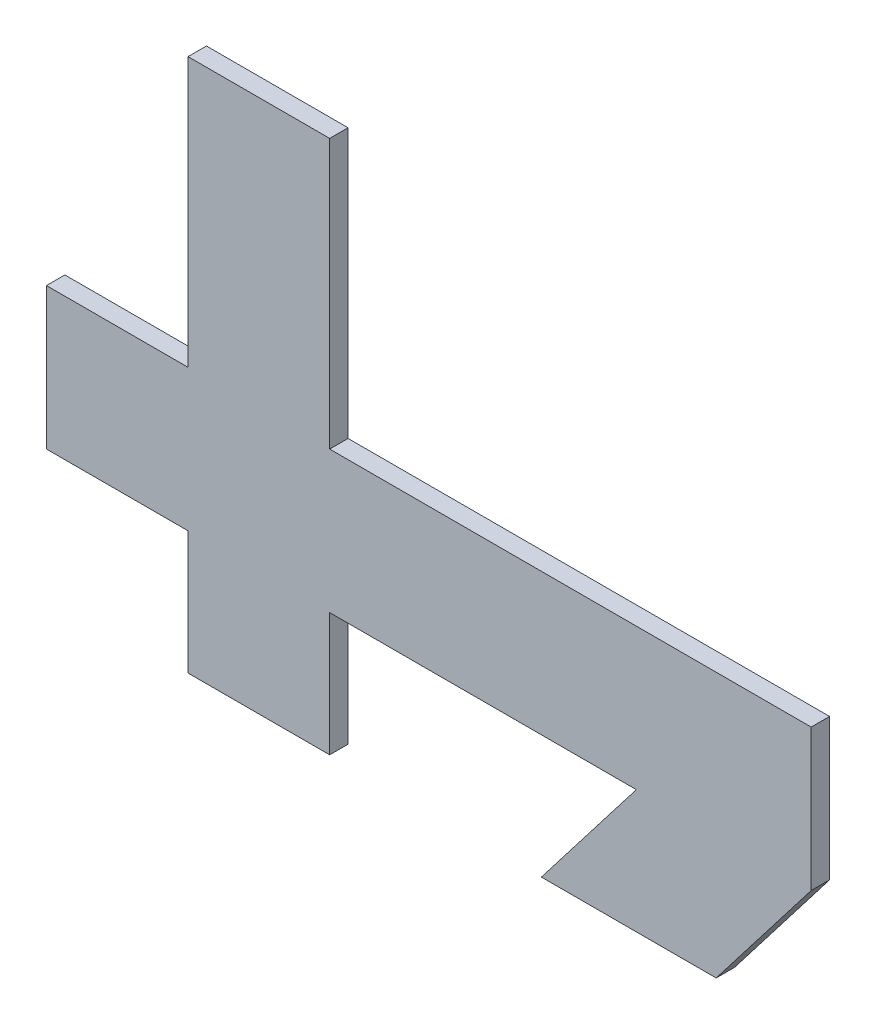
ISO-10303-21;
HEADER;
FILE_DESCRIPTION(('STEP AP214'),'2;1');
FILE_NAME('part.step','',(''),(''),'','','');
FILE_SCHEMA(('AUTOMOTIVE_DESIGN { 1 0 10303 214 1 1 1 1 }'));
ENDSEC;
DATA;
#1=APPLICATION_CONTEXT('core data for automotive mechanical design processes');
#2=APPLICATION_PROTOCOL_DEFINITION('international standard','automotive_design',2000,#1);
#3=PRODUCT_CONTEXT('',#1,'mechanical');
#4=PRODUCT('Part','Part','',(#3));
#5=PRODUCT_RELATED_PRODUCT_CATEGORY('part','',(#4));
#6=PRODUCT_DEFINITION_FORMATION('','',#4);
#7=PRODUCT_DEFINITION_CONTEXT('part definition',#1,'design');
#8=PRODUCT_DEFINITION('design','',#6,#7);
#9=PRODUCT_DEFINITION_SHAPE('','',#8);
#10=(LENGTH_UNIT() NAMED_UNIT(*) SI_UNIT(.MILLI.,.METRE.));
#11=(NAMED_UNIT(*) PLANE_ANGLE_UNIT() SI_UNIT($,.RADIAN.));
#12=(NAMED_UNIT(*) SI_UNIT($,.STERADIAN.) SOLID_ANGLE_UNIT());
#13=UNCERTAINTY_MEASURE_WITH_UNIT(LENGTH_MEASURE(1.E-05),#10,'distance_accuracy_value','');
#14=(GEOMETRIC_REPRESENTATION_CONTEXT(3) GLOBAL_UNCERTAINTY_ASSIGNED_CONTEXT((#13)) GLOBAL_UNIT_ASSIGNED_CONTEXT((#10,
#11,#12)) REPRESENTATION_CONTEXT('',''));
#15=CARTESIAN_POINT('',(0.,0.,0.));
#16=DIRECTION('',(0.,0.,1.));
#17=DIRECTION('',(1.,0.,0.));
#18=AXIS2_PLACEMENT_3D('',#15,#16,#17);
#19=CARTESIAN_POINT('',(11.1538461538462,3.84615384615385,0.5));
#20=DIRECTION('',(-0.792010197196934,0.610507860339303,0.));
#21=DIRECTION('',(-0.610507860339303,-0.792010197196934,0.));
#22=AXIS2_PLACEMENT_3D('',#19,#20,#21);
#23=PLANE('',#22);
#24=DIRECTION('',(-0.610507860339303,-0.792010197196934,0.));
#25=VECTOR('',#24,1.);
#26=CARTESIAN_POINT('',(11.1538461538462,3.84615384615385,1.));
#27=LINE('',#26,#25);
#28=CARTESIAN_POINT('',(11.1538461538462,3.84615384615385,1.));
#29=VERTEX_POINT('',#28);
#30=CARTESIAN_POINT('',(8.57451923076923,0.5,1.));
#31=VERTEX_POINT('',#30);
#32=EDGE_CURVE('E182',#29,#31,#27,.T.);
#33=ORIENTED_EDGE('',*,*,#32,.T.);
#34=DIRECTION('',(0.,0.,-1.));
#35=VECTOR('',#34,1.);
#36=CARTESIAN_POINT('',(8.57451923076923,0.5,0.5));
#37=LINE('',#36,#35);
#38=CARTESIAN_POINT('',(8.57451923076923,0.5,0.5));
#39=VERTEX_POINT('',#38);
#40=EDGE_CURVE('E60',#31,#39,#37,.T.);
#41=ORIENTED_EDGE('',*,*,#40,.T.);
#42=DIRECTION('',(-0.610507860339303,-0.792010197196934,0.));
#43=VECTOR('',#42,1.);
#44=CARTESIAN_POINT('',(11.1538461538462,3.84615384615385,0.5));
#45=LINE('',#44,#43);
#46=CARTESIAN_POINT('',(11.1538461538462,3.84615384615385,0.5));
#47=VERTEX_POINT('',#46);
#48=EDGE_CURVE('E177',#47,#39,#45,.T.);
#49=ORIENTED_EDGE('',*,*,#48,.F.);
#50=DIRECTION('',(0.,0.,1.));
#51=VECTOR('',#50,1.);
#52=CARTESIAN_POINT('',(11.1538461538462,3.84615384615385,0.5));
#53=LINE('',#52,#51);
#54=EDGE_CURVE('E160',#47,#29,#53,.T.);
#55=ORIENTED_EDGE('',*,*,#54,.T.);
#56=EDGE_LOOP('',(#33,#41,#49,#55));
#57=FACE_BOUND('',#56,.T.);
#58=ADVANCED_FACE('F39',(#57),#23,.F.);
#59=CARTESIAN_POINT('',(-5.76923076923077,-14.6153846153846,0.5));
#60=DIRECTION('',(1.,0.,0.));
#61=DIRECTION('',(0.,0.,-1.));
#62=AXIS2_PLACEMENT_3D('',#59,#60,#61);
#63=PLANE('',#62);
#64=DIRECTION('',(0.,1.,0.));
#65=VECTOR('',#64,1.);
#66=CARTESIAN_POINT('',(-5.76923076923077,-14.6153846153846,0.5));
#67=LINE('',#66,#65);
#68=CARTESIAN_POINT('',(-5.76923076923077,0.5,0.5));
#69=VERTEX_POINT('',#68);
#70=CARTESIAN_POINT('',(-5.76923076923077,3.84615384615385,0.5));
#71=VERTEX_POINT('',#70);
#72=EDGE_CURVE('E164',#69,#71,#67,.T.);
#73=ORIENTED_EDGE('',*,*,#72,.F.);
#74=DIRECTION('',(0.,0.,1.));
#75=VECTOR('',#74,1.);
#76=CARTESIAN_POINT('',(-5.76923076923077,0.5,0.5));
#77=LINE('',#76,#75);
#78=CARTESIAN_POINT('',(-5.76923076923077,0.5,1.));
#79=VERTEX_POINT('',#78);
#80=EDGE_CURVE('E148',#69,#79,#77,.T.);
#81=ORIENTED_EDGE('',*,*,#80,.T.);
#82=DIRECTION('',(0.,1.,0.));
#83=VECTOR('',#82,1.);
#84=CARTESIAN_POINT('',(-5.76923076923077,-14.6153846153846,1.));
#85=LINE('',#84,#83);
#86=CARTESIAN_POINT('',(-5.76923076923077,3.84615384615385,1.));
#87=VERTEX_POINT('',#86);
#88=EDGE_CURVE('E157',#79,#87,#85,.T.);
#89=ORIENTED_EDGE('',*,*,#88,.T.);
#90=DIRECTION('',(0.,0.,1.));
#91=VECTOR('',#90,1.);
#92=CARTESIAN_POINT('',(-5.76923076923077,3.84615384615385,0.5));
#93=LINE('',#92,#91);
#94=EDGE_CURVE('E169',#71,#87,#93,.T.);
#95=ORIENTED_EDGE('',*,*,#94,.F.);
#96=EDGE_LOOP('',(#73,#81,#89,#95));
#97=FACE_BOUND('',#96,.T.);
#98=ADVANCED_FACE('F166',(#97),#63,.F.);
#99=CARTESIAN_POINT('',(0.,0.,0.5));
#100=DIRECTION('',(0.,0.,-1.));
#101=DIRECTION('',(-1.,0.,0.));
#102=AXIS2_PLACEMENT_3D('',#99,#100,#101);
#103=PLANE('',#102);
#104=DIRECTION('',(1.,0.,0.));
#105=VECTOR('',#104,1.);
#106=CARTESIAN_POINT('',(0.,0.5,0.5));
#107=LINE('',#106,#105);
#108=CARTESIAN_POINT('',(-1.92307692307693,0.5,0.5));
#109=VERTEX_POINT('',#108);
#110=EDGE_CURVE('E47',#69,#109,#107,.T.);
#111=ORIENTED_EDGE('',*,*,#110,.F.);
#112=ORIENTED_EDGE('',*,*,#72,.T.);
#113=DIRECTION('',(-1.,0.,0.));
#114=VECTOR('',#113,1.);
#115=CARTESIAN_POINT('',(-5.76923076923077,3.84615384615385,0.5));
#116=LINE('',#115,#114);
#117=CARTESIAN_POINT('',(-9.61538461538462,3.84615384615385,0.5));
#118=VERTEX_POINT('',#117);
#119=EDGE_CURVE('E175',#71,#118,#116,.T.);
#120=ORIENTED_EDGE('',*,*,#119,.T.);
#121=DIRECTION('',(0.,1.,0.));
#122=VECTOR('',#121,1.);
#123=CARTESIAN_POINT('',(-9.61538461538462,3.84615384615385,0.5));
#124=LINE('',#123,#122);
#125=CARTESIAN_POINT('',(-9.61538461538462,7.69230769230769,0.5));
#126=VERTEX_POINT('',#125);
#127=EDGE_CURVE('E174',#118,#126,#124,.T.);
#128=ORIENTED_EDGE('',*,*,#127,.T.);
#129=DIRECTION('',(1.,0.,0.));
#130=VECTOR('',#129,1.);
#131=CARTESIAN_POINT('',(-9.61538461538462,7.69230769230769,0.5));
#132=LINE('',#131,#130);
#133=CARTESIAN_POINT('',(-5.76923076923077,7.69230769230769,0.5));
#134=VERTEX_POINT('',#133);
#135=EDGE_CURVE('E216',#126,#134,#132,.T.);
#136=ORIENTED_EDGE('',*,*,#135,.T.);
#137=DIRECTION('',(0.,1.,0.));
#138=VECTOR('',#137,1.);
#139=CARTESIAN_POINT('',(-5.76923076923077,7.69230769230769,0.5));
#140=LINE('',#139,#138);
#141=CARTESIAN_POINT('',(-5.76923076923077,15.,0.5));
#142=VERTEX_POINT('',#141);
#143=EDGE_CURVE('E212',#134,#142,#140,.T.);
#144=ORIENTED_EDGE('',*,*,#143,.T.);
#145=DIRECTION('',(1.,0.,0.));
#146=VECTOR('',#145,1.);
#147=CARTESIAN_POINT('',(-5.76923076923077,15.,0.5));
#148=LINE('',#147,#146);
#149=CARTESIAN_POINT('',(-1.92307692307693,15.,0.5));
#150=VERTEX_POINT('',#149);
#151=EDGE_CURVE('E210',#142,#150,#148,.T.);
#152=ORIENTED_EDGE('',*,*,#151,.T.);
#153=DIRECTION('',(0.,-1.,0.));
#154=VECTOR('',#153,1.);
#155=CARTESIAN_POINT('',(-1.92307692307693,15.,0.5));
#156=LINE('',#155,#154);
#157=CARTESIAN_POINT('',(-1.92307692307693,7.69230769230769,0.5));
#158=VERTEX_POINT('',#157);
#159=EDGE_CURVE('E213',#150,#158,#156,.T.);
#160=ORIENTED_EDGE('',*,*,#159,.T.);
#161=DIRECTION('',(1.,0.,0.));
#162=VECTOR('',#161,1.);
#163=CARTESIAN_POINT('',(-1.92307692307693,7.69230769230769,0.5));
#164=LINE('',#163,#162);
#165=CARTESIAN_POINT('',(11.1538461538462,7.69230769230769,0.5));
#166=VERTEX_POINT('',#165);
#167=EDGE_CURVE('E215',#158,#166,#164,.T.);
#168=ORIENTED_EDGE('',*,*,#167,.T.);
#169=DIRECTION('',(0.,-1.,0.));
#170=VECTOR('',#169,1.);
#171=CARTESIAN_POINT('',(11.1538461538462,7.69230769230769,0.5));
#172=LINE('',#171,#170);
#173=EDGE_CURVE('E185',#166,#47,#172,.T.);
#174=ORIENTED_EDGE('',*,*,#173,.T.);
#175=ORIENTED_EDGE('',*,*,#48,.T.);
#176=CARTESIAN_POINT('',(3.82684553349876,0.5,0.5));
#177=VERTEX_POINT('',#176);
#178=EDGE_CURVE('E11',#177,#39,#107,.T.);
#179=ORIENTED_EDGE('',*,*,#178,.F.);
#180=DIRECTION('',(0.610519373222298,0.792001322549561,0.));
#181=VECTOR('',#180,1.);
#182=CARTESIAN_POINT('',(-1.92307692307693,-6.95913461538462,0.5));
#183=LINE('',#182,#181);
#184=CARTESIAN_POINT('',(6.40625,3.84615384615385,0.5));
#185=VERTEX_POINT('',#184);
#186=EDGE_CURVE('E181',#177,#185,#183,.T.);
#187=ORIENTED_EDGE('',*,*,#186,.T.);
#188=DIRECTION('',(-1.,0.,0.));
#189=VECTOR('',#188,1.);
#190=CARTESIAN_POINT('',(6.40625,3.84615384615385,0.5));
#191=LINE('',#190,#189);
#192=CARTESIAN_POINT('',(-1.92307692307693,3.84615384615385,0.5));
#193=VERTEX_POINT('',#192);
#194=EDGE_CURVE('E187',#185,#193,#191,.T.);
#195=ORIENTED_EDGE('',*,*,#194,.T.);
#196=DIRECTION('',(0.,-1.,0.));
#197=VECTOR('',#196,1.);
#198=CARTESIAN_POINT('',(-1.92307692307693,3.84615384615385,0.5));
#199=LINE('',#198,#197);
#200=EDGE_CURVE('E168',#193,#109,#199,.T.);
#201=ORIENTED_EDGE('',*,*,#200,.T.);
#202=EDGE_LOOP('',(#111,#112,#120,#128,#136,#144,#152,#160,#168,#174,#175,#179,#187,#195,#201));
#203=FACE_BOUND('',#202,.T.);
#204=ADVANCED_FACE('F162',(#203),#103,.T.);
#205=CARTESIAN_POINT('',(0.,0.,1.));
#206=DIRECTION('',(0.,0.,-1.));
#207=DIRECTION('',(-1.,0.,0.));
#208=AXIS2_PLACEMENT_3D('',#205,#206,#207);
#209=PLANE('',#208);
#210=ORIENTED_EDGE('',*,*,#88,.F.);
#211=DIRECTION('',(1.,0.,0.));
#212=VECTOR('',#211,1.);
#213=CARTESIAN_POINT('',(-17.,0.5,1.));
#214=LINE('',#213,#212);
#215=CARTESIAN_POINT('',(-1.92307692307693,0.5,1.));
#216=VERTEX_POINT('',#215);
#217=EDGE_CURVE('E154',#79,#216,#214,.T.);
#218=ORIENTED_EDGE('',*,*,#217,.T.);
#219=DIRECTION('',(0.,-1.,0.));
#220=VECTOR('',#219,1.);
#221=CARTESIAN_POINT('',(-1.92307692307693,3.84615384615385,1.));
#222=LINE('',#221,#220);
#223=CARTESIAN_POINT('',(-1.92307692307693,3.84615384615385,1.));
#224=VERTEX_POINT('',#223);
#225=EDGE_CURVE('E43',#224,#216,#222,.T.);
#226=ORIENTED_EDGE('',*,*,#225,.F.);
#227=DIRECTION('',(-1.,0.,0.));
#228=VECTOR('',#227,1.);
#229=CARTESIAN_POINT('',(6.40625,3.84615384615385,1.));
#230=LINE('',#229,#228);
#231=CARTESIAN_POINT('',(6.40625,3.84615384615385,1.));
#232=VERTEX_POINT('',#231);
#233=EDGE_CURVE('E198',#232,#224,#230,.T.);
#234=ORIENTED_EDGE('',*,*,#233,.F.);
#235=DIRECTION('',(0.610519373222298,0.792001322549561,0.));
#236=VECTOR('',#235,1.);
#237=CARTESIAN_POINT('',(-1.92307692307693,-6.95913461538462,1.));
#238=LINE('',#237,#236);
#239=CARTESIAN_POINT('',(3.82684553349876,0.5,1.));
#240=VERTEX_POINT('',#239);
#241=EDGE_CURVE('E188',#240,#232,#238,.T.);
#242=ORIENTED_EDGE('',*,*,#241,.F.);
#243=EDGE_CURVE('E149',#240,#31,#214,.T.);
#244=ORIENTED_EDGE('',*,*,#243,.T.);
#245=ORIENTED_EDGE('',*,*,#32,.F.);
#246=DIRECTION('',(0.,-1.,0.));
#247=VECTOR('',#246,1.);
#248=CARTESIAN_POINT('',(11.1538461538462,7.69230769230769,1.));
#249=LINE('',#248,#247);
#250=CARTESIAN_POINT('',(11.1538461538462,7.69230769230769,1.));
#251=VERTEX_POINT('',#250);
#252=EDGE_CURVE('E229',#251,#29,#249,.T.);
#253=ORIENTED_EDGE('',*,*,#252,.F.);
#254=DIRECTION('',(1.,0.,0.));
#255=VECTOR('',#254,1.);
#256=CARTESIAN_POINT('',(-1.92307692307693,7.69230769230769,1.));
#257=LINE('',#256,#255);
#258=CARTESIAN_POINT('',(-1.92307692307693,7.69230769230769,1.));
#259=VERTEX_POINT('',#258);
#260=EDGE_CURVE('E230',#259,#251,#257,.T.);
#261=ORIENTED_EDGE('',*,*,#260,.F.);
#262=DIRECTION('',(0.,-1.,0.));
#263=VECTOR('',#262,1.);
#264=CARTESIAN_POINT('',(-1.92307692307693,15.,1.));
#265=LINE('',#264,#263);
#266=CARTESIAN_POINT('',(-1.92307692307693,15.,1.));
#267=VERTEX_POINT('',#266);
#268=EDGE_CURVE('E222',#267,#259,#265,.T.);
#269=ORIENTED_EDGE('',*,*,#268,.F.);
#270=DIRECTION('',(1.,0.,0.));
#271=VECTOR('',#270,1.);
#272=CARTESIAN_POINT('',(-5.76923076923077,15.,1.));
#273=LINE('',#272,#271);
#274=CARTESIAN_POINT('',(-5.76923076923077,15.,1.));
#275=VERTEX_POINT('',#274);
#276=EDGE_CURVE('E209',#275,#267,#273,.T.);
#277=ORIENTED_EDGE('',*,*,#276,.F.);
#278=DIRECTION('',(0.,1.,0.));
#279=VECTOR('',#278,1.);
#280=CARTESIAN_POINT('',(-5.76923076923077,7.69230769230769,1.));
#281=LINE('',#280,#279);
#282=CARTESIAN_POINT('',(-5.76923076923077,7.69230769230769,1.));
#283=VERTEX_POINT('',#282);
#284=EDGE_CURVE('E242',#283,#275,#281,.T.);
#285=ORIENTED_EDGE('',*,*,#284,.F.);
#286=DIRECTION('',(1.,0.,0.));
#287=VECTOR('',#286,1.);
#288=CARTESIAN_POINT('',(-9.61538461538462,7.69230769230769,1.));
#289=LINE('',#288,#287);
#290=CARTESIAN_POINT('',(-9.61538461538462,7.69230769230769,1.));
#291=VERTEX_POINT('',#290);
#292=EDGE_CURVE('E239',#291,#283,#289,.T.);
#293=ORIENTED_EDGE('',*,*,#292,.F.);
#294=DIRECTION('',(0.,1.,0.));
#295=VECTOR('',#294,1.);
#296=CARTESIAN_POINT('',(-9.61538461538462,3.84615384615385,1.));
#297=LINE('',#296,#295);
#298=CARTESIAN_POINT('',(-9.61538461538462,3.84615384615385,1.));
#299=VERTEX_POINT('',#298);
#300=EDGE_CURVE('E234',#299,#291,#297,.T.);
#301=ORIENTED_EDGE('',*,*,#300,.F.);
#302=DIRECTION('',(-1.,0.,0.));
#303=VECTOR('',#302,1.);
#304=CARTESIAN_POINT('',(-5.76923076923077,3.84615384615385,1.));
#305=LINE('',#304,#303);
#306=EDGE_CURVE('E232',#87,#299,#305,.T.);
#307=ORIENTED_EDGE('',*,*,#306,.F.);
#308=EDGE_LOOP('',(#210,#218,#226,#234,#242,#244,#245,#253,#261,#269,#277,#285,#293,#301,#307));
#309=FACE_BOUND('',#308,.T.);
#310=ADVANCED_FACE('F41',(#309),#209,.F.);
#311=CARTESIAN_POINT('',(-1.92307692307693,-6.95913461538462,0.5));
#312=DIRECTION('',(0.792001322549561,-0.610519373222298,0.));
#313=DIRECTION('',(0.610519373222298,0.792001322549561,0.));
#314=AXIS2_PLACEMENT_3D('',#311,#312,#313);
#315=PLANE('',#314);
#316=ORIENTED_EDGE('',*,*,#186,.F.);
#317=DIRECTION('',(0.,0.,1.));
#318=VECTOR('',#317,1.);
#319=CARTESIAN_POINT('',(3.82684553349876,0.5,0.5));
#320=LINE('',#319,#318);
#321=EDGE_CURVE('E147',#177,#240,#320,.T.);
#322=ORIENTED_EDGE('',*,*,#321,.T.);
#323=ORIENTED_EDGE('',*,*,#241,.T.);
#324=DIRECTION('',(0.,0.,1.));
#325=VECTOR('',#324,1.);
#326=CARTESIAN_POINT('',(6.40625,3.84615384615385,0.5));
#327=LINE('',#326,#325);
#328=EDGE_CURVE('E167',#185,#232,#327,.T.);
#329=ORIENTED_EDGE('',*,*,#328,.F.);
#330=EDGE_LOOP('',(#316,#322,#323,#329));
#331=FACE_BOUND('',#330,.T.);
#332=ADVANCED_FACE('F312',(#331),#315,.F.);
#333=CARTESIAN_POINT('',(-1.92307692307693,3.84615384615385,0.5));
#334=DIRECTION('',(-1.,0.,0.));
#335=DIRECTION('',(0.,0.,1.));
#336=AXIS2_PLACEMENT_3D('',#333,#334,#335);
#337=PLANE('',#336);
#338=ORIENTED_EDGE('',*,*,#225,.T.);
#339=DIRECTION('',(0.,0.,-1.));
#340=VECTOR('',#339,1.);
#341=CARTESIAN_POINT('',(-1.92307692307693,0.5,0.5));
#342=LINE('',#341,#340);
#343=EDGE_CURVE('E72',#216,#109,#342,.T.);
#344=ORIENTED_EDGE('',*,*,#343,.T.);
#345=ORIENTED_EDGE('',*,*,#200,.F.);
#346=DIRECTION('',(0.,0.,1.));
#347=VECTOR('',#346,1.);
#348=CARTESIAN_POINT('',(-1.92307692307693,3.84615384615385,0.5));
#349=LINE('',#348,#347);
#350=EDGE_CURVE('E204',#193,#224,#349,.T.);
#351=ORIENTED_EDGE('',*,*,#350,.T.);
#352=EDGE_LOOP('',(#338,#344,#345,#351));
#353=FACE_BOUND('',#352,.T.);
#354=ADVANCED_FACE('F263',(#353),#337,.F.);
#355=CARTESIAN_POINT('',(-5.76923076923077,15.,0.5));
#356=DIRECTION('',(0.,-1.,0.));
#357=DIRECTION('',(0.,0.,-1.));
#358=AXIS2_PLACEMENT_3D('',#355,#356,#357);
#359=PLANE('',#358);
#360=ORIENTED_EDGE('',*,*,#276,.T.);
#361=DIRECTION('',(0.,0.,1.));
#362=VECTOR('',#361,1.);
#363=CARTESIAN_POINT('',(-1.92307692307693,15.,0.5));
#364=LINE('',#363,#362);
#365=EDGE_CURVE('E226',#150,#267,#364,.T.);
#366=ORIENTED_EDGE('',*,*,#365,.F.);
#367=ORIENTED_EDGE('',*,*,#151,.F.);
#368=DIRECTION('',(0.,0.,1.));
#369=VECTOR('',#368,1.);
#370=CARTESIAN_POINT('',(-5.76923076923077,15.,0.5));
#371=LINE('',#370,#369);
#372=EDGE_CURVE('E223',#142,#275,#371,.T.);
#373=ORIENTED_EDGE('',*,*,#372,.T.);
#374=EDGE_LOOP('',(#360,#366,#367,#373));
#375=FACE_BOUND('',#374,.T.);
#376=ADVANCED_FACE('F290',(#375),#359,.F.);
#377=CARTESIAN_POINT('',(-1.92307692307693,15.,0.5));
#378=DIRECTION('',(-1.,0.,0.));
#379=DIRECTION('',(0.,0.,1.));
#380=AXIS2_PLACEMENT_3D('',#377,#378,#379);
#381=PLANE('',#380);
#382=ORIENTED_EDGE('',*,*,#268,.T.);
#383=DIRECTION('',(0.,0.,1.));
#384=VECTOR('',#383,1.);
#385=CARTESIAN_POINT('',(-1.92307692307693,7.69230769230769,0.5));
#386=LINE('',#385,#384);
#387=EDGE_CURVE('E227',#158,#259,#386,.T.);
#388=ORIENTED_EDGE('',*,*,#387,.F.);
#389=ORIENTED_EDGE('',*,*,#159,.F.);
#390=ORIENTED_EDGE('',*,*,#365,.T.);
#391=EDGE_LOOP('',(#382,#388,#389,#390));
#392=FACE_BOUND('',#391,.T.);
#393=ADVANCED_FACE('F292',(#392),#381,.F.);
#394=CARTESIAN_POINT('',(-1.92307692307693,7.69230769230769,0.5));
#395=DIRECTION('',(0.,-1.,0.));
#396=DIRECTION('',(0.,0.,-1.));
#397=AXIS2_PLACEMENT_3D('',#394,#395,#396);
#398=PLANE('',#397);
#399=ORIENTED_EDGE('',*,*,#260,.T.);
#400=DIRECTION('',(0.,0.,1.));
#401=VECTOR('',#400,1.);
#402=CARTESIAN_POINT('',(11.1538461538462,7.69230769230769,0.5));
#403=LINE('',#402,#401);
#404=EDGE_CURVE('E235',#166,#251,#403,.T.);
#405=ORIENTED_EDGE('',*,*,#404,.F.);
#406=ORIENTED_EDGE('',*,*,#167,.F.);
#407=ORIENTED_EDGE('',*,*,#387,.T.);
#408=EDGE_LOOP('',(#399,#405,#406,#407));
#409=FACE_BOUND('',#408,.T.);
#410=ADVANCED_FACE('F297',(#409),#398,.F.);
#411=CARTESIAN_POINT('',(11.1538461538462,7.69230769230769,0.5));
#412=DIRECTION('',(-1.,0.,0.));
#413=DIRECTION('',(0.,0.,1.));
#414=AXIS2_PLACEMENT_3D('',#411,#412,#413);
#415=PLANE('',#414);
#416=ORIENTED_EDGE('',*,*,#252,.T.);
#417=ORIENTED_EDGE('',*,*,#54,.F.);
#418=ORIENTED_EDGE('',*,*,#173,.F.);
#419=ORIENTED_EDGE('',*,*,#404,.T.);
#420=EDGE_LOOP('',(#416,#417,#418,#419));
#421=FACE_BOUND('',#420,.T.);
#422=ADVANCED_FACE('F303',(#421),#415,.F.);
#423=CARTESIAN_POINT('',(-5.76923076923077,3.84615384615385,0.5));
#424=DIRECTION('',(0.,1.,0.));
#425=DIRECTION('',(0.,0.,1.));
#426=AXIS2_PLACEMENT_3D('',#423,#424,#425);
#427=PLANE('',#426);
#428=ORIENTED_EDGE('',*,*,#306,.T.);
#429=DIRECTION('',(0.,0.,1.));
#430=VECTOR('',#429,1.);
#431=CARTESIAN_POINT('',(-9.61538461538462,3.84615384615385,0.5));
#432=LINE('',#431,#430);
#433=EDGE_CURVE('E240',#118,#299,#432,.T.);
#434=ORIENTED_EDGE('',*,*,#433,.F.);
#435=ORIENTED_EDGE('',*,*,#119,.F.);
#436=ORIENTED_EDGE('',*,*,#94,.T.);
#437=EDGE_LOOP('',(#428,#434,#435,#436));
#438=FACE_BOUND('',#437,.T.);
#439=ADVANCED_FACE('F268',(#438),#427,.F.);
#440=CARTESIAN_POINT('',(-9.61538461538462,3.84615384615385,0.5));
#441=DIRECTION('',(1.,0.,0.));
#442=DIRECTION('',(0.,0.,-1.));
#443=AXIS2_PLACEMENT_3D('',#440,#441,#442);
#444=PLANE('',#443);
#445=ORIENTED_EDGE('',*,*,#300,.T.);
#446=DIRECTION('',(0.,0.,1.));
#447=VECTOR('',#446,1.);
#448=CARTESIAN_POINT('',(-9.61538461538462,7.69230769230769,0.5));
#449=LINE('',#448,#447);
#450=EDGE_CURVE('E238',#126,#291,#449,.T.);
#451=ORIENTED_EDGE('',*,*,#450,.F.);
#452=ORIENTED_EDGE('',*,*,#127,.F.);
#453=ORIENTED_EDGE('',*,*,#433,.T.);
#454=EDGE_LOOP('',(#445,#451,#452,#453));
#455=FACE_BOUND('',#454,.T.);
#456=ADVANCED_FACE('F274',(#455),#444,.F.);
#457=CARTESIAN_POINT('',(-9.61538461538462,7.69230769230769,0.5));
#458=DIRECTION('',(0.,-1.,0.));
#459=DIRECTION('',(0.,0.,-1.));
#460=AXIS2_PLACEMENT_3D('',#457,#458,#459);
#461=PLANE('',#460);
#462=ORIENTED_EDGE('',*,*,#292,.T.);
#463=DIRECTION('',(0.,0.,1.));
#464=VECTOR('',#463,1.);
#465=CARTESIAN_POINT('',(-5.76923076923077,7.69230769230769,0.5));
#466=LINE('',#465,#464);
#467=EDGE_CURVE('E205',#134,#283,#466,.T.);
#468=ORIENTED_EDGE('',*,*,#467,.F.);
#469=ORIENTED_EDGE('',*,*,#135,.F.);
#470=ORIENTED_EDGE('',*,*,#450,.T.);
#471=EDGE_LOOP('',(#462,#468,#469,#470));
#472=FACE_BOUND('',#471,.T.);
#473=ADVANCED_FACE('F277',(#472),#461,.F.);
#474=CARTESIAN_POINT('',(-5.76923076923077,7.69230769230769,0.5));
#475=DIRECTION('',(1.,0.,0.));
#476=DIRECTION('',(0.,0.,-1.));
#477=AXIS2_PLACEMENT_3D('',#474,#475,#476);
#478=PLANE('',#477);
#479=ORIENTED_EDGE('',*,*,#284,.T.);
#480=ORIENTED_EDGE('',*,*,#372,.F.);
#481=ORIENTED_EDGE('',*,*,#143,.F.);
#482=ORIENTED_EDGE('',*,*,#467,.T.);
#483=EDGE_LOOP('',(#479,#480,#481,#482));
#484=FACE_BOUND('',#483,.T.);
#485=ADVANCED_FACE('F284',(#484),#478,.F.);
#486=CARTESIAN_POINT('',(6.40625,3.84615384615385,0.5));
#487=DIRECTION('',(0.,1.,0.));
#488=DIRECTION('',(0.,0.,1.));
#489=AXIS2_PLACEMENT_3D('',#486,#487,#488);
#490=PLANE('',#489);
#491=ORIENTED_EDGE('',*,*,#233,.T.);
#492=ORIENTED_EDGE('',*,*,#350,.F.);
#493=ORIENTED_EDGE('',*,*,#194,.F.);
#494=ORIENTED_EDGE('',*,*,#328,.T.);
#495=EDGE_LOOP('',(#491,#492,#493,#494));
#496=FACE_BOUND('',#495,.T.);
#497=ADVANCED_FACE('F325',(#496),#490,.F.);
#498=CARTESIAN_POINT('',(-17.,0.5,1.));
#499=DIRECTION('',(0.,1.,0.));
#500=DIRECTION('',(0.,0.,1.));
#501=AXIS2_PLACEMENT_3D('',#498,#499,#500);
#502=PLANE('',#501);
#503=ORIENTED_EDGE('',*,*,#110,.T.);
#504=ORIENTED_EDGE('',*,*,#343,.F.);
#505=ORIENTED_EDGE('',*,*,#217,.F.);
#506=ORIENTED_EDGE('',*,*,#80,.F.);
#507=EDGE_LOOP('',(#503,#504,#505,#506));
#508=FACE_BOUND('',#507,.T.);
#509=ADVANCED_FACE('F152',(#508),#502,.F.);
#510=ORIENTED_EDGE('',*,*,#243,.F.);
#511=ORIENTED_EDGE('',*,*,#321,.F.);
#512=ORIENTED_EDGE('',*,*,#178,.T.);
#513=ORIENTED_EDGE('',*,*,#40,.F.);
#514=EDGE_LOOP('',(#510,#511,#512,#513));
#515=FACE_BOUND('',#514,.T.);
#516=ADVANCED_FACE('F317',(#515),#502,.F.);
#517=CLOSED_SHELL('',(#58,#98,#204,#310,#332,#354,#376,#393,#410,#422,#439,#456,#473,#485,#497,
#509,#516));
#518=MANIFOLD_SOLID_BREP('B2',#517);
#519=ADVANCED_BREP_SHAPE_REPRESENTATION('',(#18,#518),#14);
#520=SHAPE_DEFINITION_REPRESENTATION(#9,#519);
ENDSEC;
END-ISO-10303-21;
